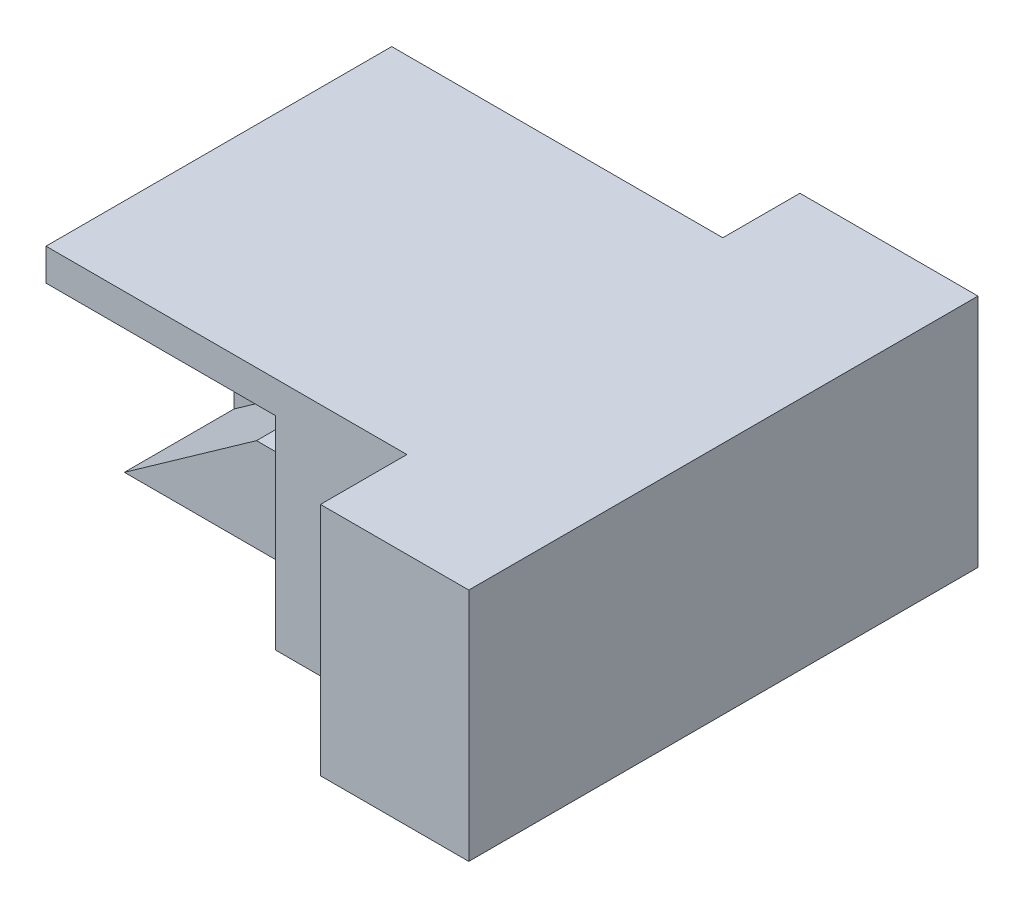
ISO-10303-21;
HEADER;
FILE_DESCRIPTION(('STEP AP214'),'2;1');
FILE_NAME('part.step','',(''),(''),'','','');
FILE_SCHEMA(('AUTOMOTIVE_DESIGN { 1 0 10303 214 1 1 1 1 }'));
ENDSEC;
DATA;
#1=APPLICATION_CONTEXT('core data for automotive mechanical design processes');
#2=APPLICATION_PROTOCOL_DEFINITION('international standard','automotive_design',2000,#1);
#3=PRODUCT_CONTEXT('',#1,'mechanical');
#4=PRODUCT('Part','Part','',(#3));
#5=PRODUCT_RELATED_PRODUCT_CATEGORY('part','',(#4));
#6=PRODUCT_DEFINITION_FORMATION('','',#4);
#7=PRODUCT_DEFINITION_CONTEXT('part definition',#1,'design');
#8=PRODUCT_DEFINITION('design','',#6,#7);
#9=PRODUCT_DEFINITION_SHAPE('','',#8);
#10=(LENGTH_UNIT() NAMED_UNIT(*) SI_UNIT(.MILLI.,.METRE.));
#11=(NAMED_UNIT(*) PLANE_ANGLE_UNIT() SI_UNIT($,.RADIAN.));
#12=(NAMED_UNIT(*) SI_UNIT($,.STERADIAN.) SOLID_ANGLE_UNIT());
#13=UNCERTAINTY_MEASURE_WITH_UNIT(LENGTH_MEASURE(1.E-05),#10,'distance_accuracy_value','');
#14=(GEOMETRIC_REPRESENTATION_CONTEXT(3) GLOBAL_UNCERTAINTY_ASSIGNED_CONTEXT((#13)) GLOBAL_UNIT_ASSIGNED_CONTEXT((#10,
#11,#12)) REPRESENTATION_CONTEXT('',''));
#15=CARTESIAN_POINT('',(0.,0.,0.));
#16=DIRECTION('',(0.,0.,1.));
#17=DIRECTION('',(1.,0.,0.));
#18=AXIS2_PLACEMENT_3D('',#15,#16,#17);
#19=CARTESIAN_POINT('',(4.5485301818501,30.,-18.1880733944954));
#20=DIRECTION('',(0.,0.,1.));
#21=DIRECTION('',(1.,0.,0.));
#22=AXIS2_PLACEMENT_3D('',#19,#20,#21);
#23=PLANE('',#22);
#24=DIRECTION('',(-1.,0.,0.));
#25=VECTOR('',#24,1.);
#26=CARTESIAN_POINT('',(4.5485301818501,0.,-18.1880733944954));
#27=LINE('',#26,#25);
#28=CARTESIAN_POINT('',(4.5485301818501,0.,-18.1880733944954));
#29=VERTEX_POINT('',#28);
#30=CARTESIAN_POINT('',(-37.7178899082569,0.,-18.1880733944954));
#31=VERTEX_POINT('',#30);
#32=EDGE_CURVE('E178',#29,#31,#27,.T.);
#33=ORIENTED_EDGE('',*,*,#32,.T.);
#34=DIRECTION('',(0.,-1.,0.));
#35=VECTOR('',#34,1.);
#36=CARTESIAN_POINT('',(-37.7178899082569,30.,-18.1880733944954));
#37=LINE('',#36,#35);
#38=CARTESIAN_POINT('',(-37.7178899082569,30.,-18.1880733944954));
#39=VERTEX_POINT('',#38);
#40=EDGE_CURVE('E42',#39,#31,#37,.T.);
#41=ORIENTED_EDGE('',*,*,#40,.F.);
#42=DIRECTION('',(-1.,0.,0.));
#43=VECTOR('',#42,1.);
#44=CARTESIAN_POINT('',(4.5485301818501,30.,-18.1880733944954));
#45=LINE('',#44,#43);
#46=CARTESIAN_POINT('',(4.5485301818501,30.,-18.1880733944954));
#47=VERTEX_POINT('',#46);
#48=EDGE_CURVE('E159',#47,#39,#45,.T.);
#49=ORIENTED_EDGE('',*,*,#48,.F.);
#50=DIRECTION('',(0.,-1.,0.));
#51=VECTOR('',#50,1.);
#52=CARTESIAN_POINT('',(4.5485301818501,30.,-18.1880733944954));
#53=LINE('',#52,#51);
#54=EDGE_CURVE('E177',#47,#29,#53,.T.);
#55=ORIENTED_EDGE('',*,*,#54,.T.);
#56=EDGE_LOOP('',(#33,#41,#49,#55));
#57=FACE_BOUND('',#56,.T.);
#58=ADVANCED_FACE('F35',(#57),#23,.F.);
#59=CARTESIAN_POINT('',(-37.7178899082569,30.,-18.1880733944954));
#60=DIRECTION('',(1.,0.,0.));
#61=DIRECTION('',(0.,0.,-1.));
#62=AXIS2_PLACEMENT_3D('',#59,#60,#61);
#63=PLANE('',#62);
#64=DIRECTION('',(0.,-1.,0.));
#65=VECTOR('',#64,1.);
#66=CARTESIAN_POINT('',(-37.7178899082569,25.912398034568,1.94036697247707));
#67=LINE('',#66,#65);
#68=CARTESIAN_POINT('',(-37.7178899082569,25.912398034568,1.94036697247707));
#69=VERTEX_POINT('',#68);
#70=CARTESIAN_POINT('',(-37.7178899082569,0.,1.94036697247707));
#71=VERTEX_POINT('',#70);
#72=EDGE_CURVE('E56',#69,#71,#67,.T.);
#73=ORIENTED_EDGE('',*,*,#72,.F.);
#74=DIRECTION('',(0.,0.,1.));
#75=VECTOR('',#74,1.);
#76=CARTESIAN_POINT('',(-37.7178899082569,25.912398034568,1.94036697247707));
#77=LINE('',#76,#75);
#78=CARTESIAN_POINT('',(-37.7178899082569,25.912398034568,25.9403669724771));
#79=VERTEX_POINT('',#78);
#80=EDGE_CURVE('E182',#69,#79,#77,.T.);
#81=ORIENTED_EDGE('',*,*,#80,.T.);
#82=DIRECTION('',(0.,-1.,0.));
#83=VECTOR('',#82,1.);
#84=CARTESIAN_POINT('',(-37.7178899082569,30.,25.9403669724771));
#85=LINE('',#84,#83);
#86=CARTESIAN_POINT('',(-37.7178899082569,30.,25.9403669724771));
#87=VERTEX_POINT('',#86);
#88=EDGE_CURVE('E212',#87,#79,#85,.T.);
#89=ORIENTED_EDGE('',*,*,#88,.F.);
#90=DIRECTION('',(0.,0.,1.));
#91=VECTOR('',#90,1.);
#92=CARTESIAN_POINT('',(-37.7178899082569,30.,-18.1880733944954));
#93=LINE('',#92,#91);
#94=EDGE_CURVE('E162',#39,#87,#93,.T.);
#95=ORIENTED_EDGE('',*,*,#94,.F.);
#96=ORIENTED_EDGE('',*,*,#40,.T.);
#97=DIRECTION('',(0.,0.,1.));
#98=VECTOR('',#97,1.);
#99=CARTESIAN_POINT('',(-37.7178899082569,0.,-18.1880733944954));
#100=LINE('',#99,#98);
#101=EDGE_CURVE('E181',#31,#71,#100,.T.);
#102=ORIENTED_EDGE('',*,*,#101,.T.);
#103=EDGE_LOOP('',(#73,#81,#89,#95,#96,#102));
#104=FACE_BOUND('',#103,.T.);
#105=ADVANCED_FACE('F217',(#104),#63,.F.);
#106=CARTESIAN_POINT('',(-37.7178899082569,30.,25.9403669724771));
#107=DIRECTION('',(0.,0.,-1.));
#108=DIRECTION('',(-1.,0.,0.));
#109=AXIS2_PLACEMENT_3D('',#106,#107,#108);
#110=PLANE('',#109);
#111=DIRECTION('',(0.,1.,0.));
#112=VECTOR('',#111,1.);
#113=CARTESIAN_POINT('',(-8.41163908856649,25.912398034568,25.9403669724771));
#114=LINE('',#113,#112);
#115=CARTESIAN_POINT('',(-8.41163908856649,0.,25.9403669724771));
#116=VERTEX_POINT('',#115);
#117=CARTESIAN_POINT('',(-8.41163908856649,25.912398034568,25.9403669724771));
#118=VERTEX_POINT('',#117);
#119=EDGE_CURVE('E253',#116,#118,#114,.T.);
#120=ORIENTED_EDGE('',*,*,#119,.F.);
#121=DIRECTION('',(1.,0.,0.));
#122=VECTOR('',#121,1.);
#123=CARTESIAN_POINT('',(-37.7178899082569,0.,25.9403669724771));
#124=LINE('',#123,#122);
#125=CARTESIAN_POINT('',(8.348623853211,0.,25.9403669724771));
#126=VERTEX_POINT('',#125);
#127=EDGE_CURVE('E184',#116,#126,#124,.T.);
#128=ORIENTED_EDGE('',*,*,#127,.T.);
#129=DIRECTION('',(0.,-1.,0.));
#130=VECTOR('',#129,1.);
#131=CARTESIAN_POINT('',(8.348623853211,30.,25.9403669724771));
#132=LINE('',#131,#130);
#133=CARTESIAN_POINT('',(8.348623853211,30.,25.9403669724771));
#134=VERTEX_POINT('',#133);
#135=EDGE_CURVE('E209',#134,#126,#132,.T.);
#136=ORIENTED_EDGE('',*,*,#135,.F.);
#137=DIRECTION('',(1.,0.,0.));
#138=VECTOR('',#137,1.);
#139=CARTESIAN_POINT('',(-37.7178899082569,30.,25.9403669724771));
#140=LINE('',#139,#138);
#141=EDGE_CURVE('E165',#87,#134,#140,.T.);
#142=ORIENTED_EDGE('',*,*,#141,.F.);
#143=ORIENTED_EDGE('',*,*,#88,.T.);
#144=DIRECTION('',(-1.,0.,0.));
#145=VECTOR('',#144,1.);
#146=CARTESIAN_POINT('',(-37.7178899082569,25.912398034568,25.9403669724771));
#147=LINE('',#146,#145);
#148=EDGE_CURVE('E254',#118,#79,#147,.T.);
#149=ORIENTED_EDGE('',*,*,#148,.F.);
#150=EDGE_LOOP('',(#120,#128,#136,#142,#143,#149));
#151=FACE_BOUND('',#150,.T.);
#152=ADVANCED_FACE('F250',(#151),#110,.F.);
#153=CARTESIAN_POINT('',(8.348623853211,30.,25.9403669724771));
#154=DIRECTION('',(1.,0.,0.));
#155=DIRECTION('',(0.,0.,-1.));
#156=AXIS2_PLACEMENT_3D('',#153,#154,#155);
#157=PLANE('',#156);
#158=DIRECTION('',(0.,0.,1.));
#159=VECTOR('',#158,1.);
#160=CARTESIAN_POINT('',(8.348623853211,0.,25.9403669724771));
#161=LINE('',#160,#159);
#162=CARTESIAN_POINT('',(8.348623853211,0.,36.9724770642202));
#163=VERTEX_POINT('',#162);
#164=EDGE_CURVE('E186',#126,#163,#161,.T.);
#165=ORIENTED_EDGE('',*,*,#164,.T.);
#166=DIRECTION('',(0.,-1.,0.));
#167=VECTOR('',#166,1.);
#168=CARTESIAN_POINT('',(8.348623853211,30.,36.9724770642202));
#169=LINE('',#168,#167);
#170=CARTESIAN_POINT('',(8.348623853211,30.,36.9724770642202));
#171=VERTEX_POINT('',#170);
#172=EDGE_CURVE('E206',#171,#163,#169,.T.);
#173=ORIENTED_EDGE('',*,*,#172,.F.);
#174=DIRECTION('',(0.,0.,1.));
#175=VECTOR('',#174,1.);
#176=CARTESIAN_POINT('',(8.348623853211,30.,25.9403669724771));
#177=LINE('',#176,#175);
#178=EDGE_CURVE('E167',#134,#171,#177,.T.);
#179=ORIENTED_EDGE('',*,*,#178,.F.);
#180=ORIENTED_EDGE('',*,*,#135,.T.);
#181=EDGE_LOOP('',(#165,#173,#179,#180));
#182=FACE_BOUND('',#181,.T.);
#183=ADVANCED_FACE('F246',(#182),#157,.F.);
#184=CARTESIAN_POINT('',(8.348623853211,30.,36.9724770642202));
#185=DIRECTION('',(0.,0.,-1.));
#186=DIRECTION('',(-1.,0.,0.));
#187=AXIS2_PLACEMENT_3D('',#184,#185,#186);
#188=PLANE('',#187);
#189=DIRECTION('',(1.,0.,0.));
#190=VECTOR('',#189,1.);
#191=CARTESIAN_POINT('',(8.348623853211,0.,36.9724770642202));
#192=LINE('',#191,#190);
#193=CARTESIAN_POINT('',(27.2821100917431,0.,36.9724770642202));
#194=VERTEX_POINT('',#193);
#195=EDGE_CURVE('E188',#163,#194,#192,.T.);
#196=ORIENTED_EDGE('',*,*,#195,.T.);
#197=DIRECTION('',(0.,-1.,0.));
#198=VECTOR('',#197,1.);
#199=CARTESIAN_POINT('',(27.2821100917431,30.,36.9724770642202));
#200=LINE('',#199,#198);
#201=CARTESIAN_POINT('',(27.2821100917431,30.,36.9724770642202));
#202=VERTEX_POINT('',#201);
#203=EDGE_CURVE('E203',#202,#194,#200,.T.);
#204=ORIENTED_EDGE('',*,*,#203,.F.);
#205=DIRECTION('',(1.,0.,0.));
#206=VECTOR('',#205,1.);
#207=CARTESIAN_POINT('',(8.348623853211,30.,36.9724770642202));
#208=LINE('',#207,#206);
#209=EDGE_CURVE('E169',#171,#202,#208,.T.);
#210=ORIENTED_EDGE('',*,*,#209,.F.);
#211=ORIENTED_EDGE('',*,*,#172,.T.);
#212=EDGE_LOOP('',(#196,#204,#210,#211));
#213=FACE_BOUND('',#212,.T.);
#214=ADVANCED_FACE('F241',(#213),#188,.F.);
#215=CARTESIAN_POINT('',(27.2821100917431,30.,36.9724770642202));
#216=DIRECTION('',(-1.,0.,0.));
#217=DIRECTION('',(0.,0.,1.));
#218=AXIS2_PLACEMENT_3D('',#215,#216,#217);
#219=PLANE('',#218);
#220=DIRECTION('',(0.,0.,-1.));
#221=VECTOR('',#220,1.);
#222=CARTESIAN_POINT('',(27.2821100917431,0.,36.9724770642202));
#223=LINE('',#222,#221);
#224=CARTESIAN_POINT('',(27.2821100917431,0.,-28.0275229357798));
#225=VERTEX_POINT('',#224);
#226=EDGE_CURVE('E190',#194,#225,#223,.T.);
#227=ORIENTED_EDGE('',*,*,#226,.T.);
#228=DIRECTION('',(0.,-1.,0.));
#229=VECTOR('',#228,1.);
#230=CARTESIAN_POINT('',(27.2821100917431,30.,-28.0275229357798));
#231=LINE('',#230,#229);
#232=CARTESIAN_POINT('',(27.2821100917431,30.,-28.0275229357798));
#233=VERTEX_POINT('',#232);
#234=EDGE_CURVE('E200',#233,#225,#231,.T.);
#235=ORIENTED_EDGE('',*,*,#234,.F.);
#236=DIRECTION('',(0.,0.,-1.));
#237=VECTOR('',#236,1.);
#238=CARTESIAN_POINT('',(27.2821100917431,30.,36.9724770642202));
#239=LINE('',#238,#237);
#240=EDGE_CURVE('E171',#202,#233,#239,.T.);
#241=ORIENTED_EDGE('',*,*,#240,.F.);
#242=ORIENTED_EDGE('',*,*,#203,.T.);
#243=EDGE_LOOP('',(#227,#235,#241,#242));
#244=FACE_BOUND('',#243,.T.);
#245=ADVANCED_FACE('F236',(#244),#219,.F.);
#246=CARTESIAN_POINT('',(27.2821100917431,30.,-28.0275229357798));
#247=DIRECTION('',(0.,0.,1.));
#248=DIRECTION('',(1.,0.,0.));
#249=AXIS2_PLACEMENT_3D('',#246,#247,#248);
#250=PLANE('',#249);
#251=DIRECTION('',(-1.,0.,0.));
#252=VECTOR('',#251,1.);
#253=CARTESIAN_POINT('',(27.2821100917431,0.,-28.0275229357798));
#254=LINE('',#253,#252);
#255=CARTESIAN_POINT('',(4.5485301818501,0.,-28.0275229357798));
#256=VERTEX_POINT('',#255);
#257=EDGE_CURVE('E192',#225,#256,#254,.T.);
#258=ORIENTED_EDGE('',*,*,#257,.T.);
#259=DIRECTION('',(0.,-1.,0.));
#260=VECTOR('',#259,1.);
#261=CARTESIAN_POINT('',(4.5485301818501,30.,-28.0275229357798));
#262=LINE('',#261,#260);
#263=CARTESIAN_POINT('',(4.5485301818501,30.,-28.0275229357798));
#264=VERTEX_POINT('',#263);
#265=EDGE_CURVE('E197',#264,#256,#262,.T.);
#266=ORIENTED_EDGE('',*,*,#265,.F.);
#267=DIRECTION('',(-1.,0.,0.));
#268=VECTOR('',#267,1.);
#269=CARTESIAN_POINT('',(27.2821100917431,30.,-28.0275229357798));
#270=LINE('',#269,#268);
#271=EDGE_CURVE('E173',#233,#264,#270,.T.);
#272=ORIENTED_EDGE('',*,*,#271,.F.);
#273=ORIENTED_EDGE('',*,*,#234,.T.);
#274=EDGE_LOOP('',(#258,#266,#272,#273));
#275=FACE_BOUND('',#274,.T.);
#276=ADVANCED_FACE('F232',(#275),#250,.F.);
#277=CARTESIAN_POINT('',(4.5485301818501,30.,-28.0275229357798));
#278=DIRECTION('',(1.,0.,0.));
#279=DIRECTION('',(0.,0.,-1.));
#280=AXIS2_PLACEMENT_3D('',#277,#278,#279);
#281=PLANE('',#280);
#282=DIRECTION('',(0.,0.,1.));
#283=VECTOR('',#282,1.);
#284=CARTESIAN_POINT('',(4.5485301818501,0.,-28.0275229357798));
#285=LINE('',#284,#283);
#286=EDGE_CURVE('E163',#256,#29,#285,.T.);
#287=ORIENTED_EDGE('',*,*,#286,.T.);
#288=ORIENTED_EDGE('',*,*,#54,.F.);
#289=DIRECTION('',(0.,0.,1.));
#290=VECTOR('',#289,1.);
#291=CARTESIAN_POINT('',(4.5485301818501,30.,-28.0275229357798));
#292=LINE('',#291,#290);
#293=EDGE_CURVE('E175',#264,#47,#292,.T.);
#294=ORIENTED_EDGE('',*,*,#293,.F.);
#295=ORIENTED_EDGE('',*,*,#265,.T.);
#296=EDGE_LOOP('',(#287,#288,#294,#295));
#297=FACE_BOUND('',#296,.T.);
#298=ADVANCED_FACE('F227',(#297),#281,.F.);
#299=CARTESIAN_POINT('',(0.,30.,0.));
#300=DIRECTION('',(0.,1.,0.));
#301=DIRECTION('',(0.,0.,1.));
#302=AXIS2_PLACEMENT_3D('',#299,#300,#301);
#303=PLANE('',#302);
#304=ORIENTED_EDGE('',*,*,#48,.T.);
#305=ORIENTED_EDGE('',*,*,#94,.T.);
#306=ORIENTED_EDGE('',*,*,#141,.T.);
#307=ORIENTED_EDGE('',*,*,#178,.T.);
#308=ORIENTED_EDGE('',*,*,#209,.T.);
#309=ORIENTED_EDGE('',*,*,#240,.T.);
#310=ORIENTED_EDGE('',*,*,#271,.T.);
#311=ORIENTED_EDGE('',*,*,#293,.T.);
#312=EDGE_LOOP('',(#304,#305,#306,#307,#308,#309,#310,#311));
#313=FACE_BOUND('',#312,.T.);
#314=ADVANCED_FACE('F307',(#313),#303,.T.);
#315=CARTESIAN_POINT('',(0.,0.,0.));
#316=DIRECTION('',(0.,1.,0.));
#317=DIRECTION('',(0.,0.,1.));
#318=AXIS2_PLACEMENT_3D('',#315,#316,#317);
#319=PLANE('',#318);
#320=ORIENTED_EDGE('',*,*,#127,.F.);
#321=DIRECTION('',(0.,0.,1.));
#322=VECTOR('',#321,1.);
#323=CARTESIAN_POINT('',(-8.41163908856649,0.,15.9403669724771));
#324=LINE('',#323,#322);
#325=CARTESIAN_POINT('',(-8.41163908856649,0.,15.9403669724771));
#326=VERTEX_POINT('',#325);
#327=EDGE_CURVE('E145',#326,#116,#324,.T.);
#328=ORIENTED_EDGE('',*,*,#327,.F.);
#329=DIRECTION('',(1.,0.,0.));
#330=VECTOR('',#329,1.);
#331=CARTESIAN_POINT('',(-37.7178899082569,0.,15.9403669724771));
#332=LINE('',#331,#330);
#333=CARTESIAN_POINT('',(-37.7178899082569,0.,15.9403669724771));
#334=VERTEX_POINT('',#333);
#335=EDGE_CURVE('E133',#334,#326,#332,.T.);
#336=ORIENTED_EDGE('',*,*,#335,.F.);
#337=DIRECTION('',(0.,0.,1.));
#338=VECTOR('',#337,1.);
#339=CARTESIAN_POINT('',(-37.7178899082569,0.,1.94036697247707));
#340=LINE('',#339,#338);
#341=EDGE_CURVE('E142',#71,#334,#340,.T.);
#342=ORIENTED_EDGE('',*,*,#341,.F.);
#343=ORIENTED_EDGE('',*,*,#101,.F.);
#344=ORIENTED_EDGE('',*,*,#32,.F.);
#345=ORIENTED_EDGE('',*,*,#286,.F.);
#346=ORIENTED_EDGE('',*,*,#257,.F.);
#347=ORIENTED_EDGE('',*,*,#226,.F.);
#348=ORIENTED_EDGE('',*,*,#195,.F.);
#349=ORIENTED_EDGE('',*,*,#164,.F.);
#350=EDGE_LOOP('',(#320,#328,#336,#342,#343,#344,#345,#346,#347,#348,#349));
#351=FACE_BOUND('',#350,.T.);
#352=ADVANCED_FACE('F141',(#351),#319,.F.);
#353=CARTESIAN_POINT('',(-37.7178899082569,25.912398034568,1.94036697247707));
#354=DIRECTION('',(0.,1.,0.));
#355=DIRECTION('',(0.,0.,1.));
#356=AXIS2_PLACEMENT_3D('',#353,#354,#355);
#357=PLANE('',#356);
#358=ORIENTED_EDGE('',*,*,#148,.T.);
#359=ORIENTED_EDGE('',*,*,#80,.F.);
#360=DIRECTION('',(-1.,0.,0.));
#361=VECTOR('',#360,1.);
#362=CARTESIAN_POINT('',(-37.7178899082569,25.912398034568,1.94036697247707));
#363=LINE('',#362,#361);
#364=CARTESIAN_POINT('',(-8.41163908856649,25.912398034568,1.94036697247707));
#365=VERTEX_POINT('',#364);
#366=EDGE_CURVE('E151',#365,#69,#363,.T.);
#367=ORIENTED_EDGE('',*,*,#366,.F.);
#368=DIRECTION('',(0.,0.,1.));
#369=VECTOR('',#368,1.);
#370=CARTESIAN_POINT('',(-8.41163908856649,25.912398034568,1.94036697247707));
#371=LINE('',#370,#369);
#372=EDGE_CURVE('E273',#365,#118,#371,.T.);
#373=ORIENTED_EDGE('',*,*,#372,.T.);
#374=EDGE_LOOP('',(#358,#359,#367,#373));
#375=FACE_BOUND('',#374,.T.);
#376=ADVANCED_FACE('F310',(#375),#357,.F.);
#377=CARTESIAN_POINT('',(-8.41163908856649,25.912398034568,1.94036697247707));
#378=DIRECTION('',(1.,0.,0.));
#379=DIRECTION('',(0.,0.,-1.));
#380=AXIS2_PLACEMENT_3D('',#377,#378,#379);
#381=PLANE('',#380);
#382=ORIENTED_EDGE('',*,*,#119,.T.);
#383=ORIENTED_EDGE('',*,*,#372,.F.);
#384=DIRECTION('',(0.,1.,0.));
#385=VECTOR('',#384,1.);
#386=CARTESIAN_POINT('',(-8.41163908856649,25.912398034568,1.94036697247707));
#387=LINE('',#386,#385);
#388=CARTESIAN_POINT('',(-8.41163908856649,11.9357927432809,1.94036697247707));
#389=VERTEX_POINT('',#388);
#390=EDGE_CURVE('E155',#389,#365,#387,.T.);
#391=ORIENTED_EDGE('',*,*,#390,.F.);
#392=DIRECTION('',(0.,0.,1.));
#393=VECTOR('',#392,1.);
#394=CARTESIAN_POINT('',(-8.41163908856649,11.9357927432809,1.94036697247707));
#395=LINE('',#394,#393);
#396=CARTESIAN_POINT('',(-8.41163908856649,11.9357927432809,15.9403669724771));
#397=VERTEX_POINT('',#396);
#398=EDGE_CURVE('E153',#389,#397,#395,.T.);
#399=ORIENTED_EDGE('',*,*,#398,.T.);
#400=DIRECTION('',(0.,1.,0.));
#401=VECTOR('',#400,1.);
#402=CARTESIAN_POINT('',(-8.41163908856649,0.,15.9403669724771));
#403=LINE('',#402,#401);
#404=EDGE_CURVE('E146',#326,#397,#403,.T.);
#405=ORIENTED_EDGE('',*,*,#404,.F.);
#406=ORIENTED_EDGE('',*,*,#327,.T.);
#407=EDGE_LOOP('',(#382,#383,#391,#399,#405,#406));
#408=FACE_BOUND('',#407,.T.);
#409=ADVANCED_FACE('F257',(#408),#381,.F.);
#410=CARTESIAN_POINT('',(-8.41163908856649,11.9357927432809,1.94036697247707));
#411=DIRECTION('',(0.,-1.,0.));
#412=DIRECTION('',(0.,0.,-1.));
#413=AXIS2_PLACEMENT_3D('',#410,#411,#412);
#414=PLANE('',#413);
#415=DIRECTION('',(0.,0.,1.));
#416=VECTOR('',#415,1.);
#417=CARTESIAN_POINT('',(-20.845998278746,11.9357927432809,1.94036697247707));
#418=LINE('',#417,#416);
#419=CARTESIAN_POINT('',(-20.845998278746,11.9357927432809,1.94036697247707));
#420=VERTEX_POINT('',#419);
#421=CARTESIAN_POINT('',(-20.845998278746,11.9357927432809,15.9403669724771));
#422=VERTEX_POINT('',#421);
#423=EDGE_CURVE('E150',#420,#422,#418,.T.);
#424=ORIENTED_EDGE('',*,*,#423,.T.);
#425=DIRECTION('',(-1.,0.,0.));
#426=VECTOR('',#425,1.);
#427=CARTESIAN_POINT('',(-37.7178899082569,11.9357927432809,15.9403669724771));
#428=LINE('',#427,#426);
#429=EDGE_CURVE('E49',#397,#422,#428,.T.);
#430=ORIENTED_EDGE('',*,*,#429,.F.);
#431=ORIENTED_EDGE('',*,*,#398,.F.);
#432=DIRECTION('',(1.,0.,0.));
#433=VECTOR('',#432,1.);
#434=CARTESIAN_POINT('',(-8.41163908856649,11.9357927432809,1.94036697247707));
#435=LINE('',#434,#433);
#436=EDGE_CURVE('E265',#420,#389,#435,.T.);
#437=ORIENTED_EDGE('',*,*,#436,.F.);
#438=EDGE_LOOP('',(#424,#430,#431,#437));
#439=FACE_BOUND('',#438,.T.);
#440=ADVANCED_FACE('F277',(#439),#414,.F.);
#441=CARTESIAN_POINT('',(-20.845998278746,11.9357927432809,1.94036697247707));
#442=DIRECTION('',(0.577529728708844,-0.816369654297298,0.));
#443=DIRECTION('',(0.816369654297298,0.577529728708844,0.));
#444=AXIS2_PLACEMENT_3D('',#441,#442,#443);
#445=PLANE('',#444);
#446=ORIENTED_EDGE('',*,*,#341,.T.);
#447=DIRECTION('',(0.816369654297298,0.577529728708844,0.));
#448=VECTOR('',#447,1.);
#449=CARTESIAN_POINT('',(-20.845998278746,11.9357927432809,15.9403669724771));
#450=LINE('',#449,#448);
#451=EDGE_CURVE('E11',#334,#422,#450,.T.);
#452=ORIENTED_EDGE('',*,*,#451,.T.);
#453=ORIENTED_EDGE('',*,*,#423,.F.);
#454=DIRECTION('',(0.816369654297298,0.577529728708844,0.));
#455=VECTOR('',#454,1.);
#456=CARTESIAN_POINT('',(-20.845998278746,11.9357927432809,1.94036697247707));
#457=LINE('',#456,#455);
#458=EDGE_CURVE('E149',#71,#420,#457,.T.);
#459=ORIENTED_EDGE('',*,*,#458,.F.);
#460=EDGE_LOOP('',(#446,#452,#453,#459));
#461=FACE_BOUND('',#460,.T.);
#462=ADVANCED_FACE('F148',(#461),#445,.F.);
#463=CARTESIAN_POINT('',(0.,0.,1.94036697247707));
#464=DIRECTION('',(0.,0.,-1.));
#465=DIRECTION('',(-1.,0.,0.));
#466=AXIS2_PLACEMENT_3D('',#463,#464,#465);
#467=PLANE('',#466);
#468=ORIENTED_EDGE('',*,*,#72,.T.);
#469=ORIENTED_EDGE('',*,*,#458,.T.);
#470=ORIENTED_EDGE('',*,*,#436,.T.);
#471=ORIENTED_EDGE('',*,*,#390,.T.);
#472=ORIENTED_EDGE('',*,*,#366,.T.);
#473=EDGE_LOOP('',(#468,#469,#470,#471,#472));
#474=FACE_BOUND('',#473,.T.);
#475=ADVANCED_FACE('F278',(#474),#467,.F.);
#476=CARTESIAN_POINT('',(0.,0.,15.9403669724771));
#477=DIRECTION('',(0.,0.,-1.));
#478=DIRECTION('',(-1.,0.,0.));
#479=AXIS2_PLACEMENT_3D('',#476,#477,#478);
#480=PLANE('',#479);
#481=ORIENTED_EDGE('',*,*,#335,.T.);
#482=ORIENTED_EDGE('',*,*,#404,.T.);
#483=ORIENTED_EDGE('',*,*,#429,.T.);
#484=ORIENTED_EDGE('',*,*,#451,.F.);
#485=EDGE_LOOP('',(#481,#482,#483,#484));
#486=FACE_BOUND('',#485,.T.);
#487=ADVANCED_FACE('F132',(#486),#480,.F.);
#488=CLOSED_SHELL('',(#58,#105,#152,#183,#214,#245,#276,#298,#314,#352,#376,#409,#440,#462,#475,#487));
#489=MANIFOLD_SOLID_BREP('B2',#488);
#490=ADVANCED_BREP_SHAPE_REPRESENTATION('',(#18,#489),#14);
#491=SHAPE_DEFINITION_REPRESENTATION(#9,#490);
ENDSEC;
END-ISO-10303-21;
